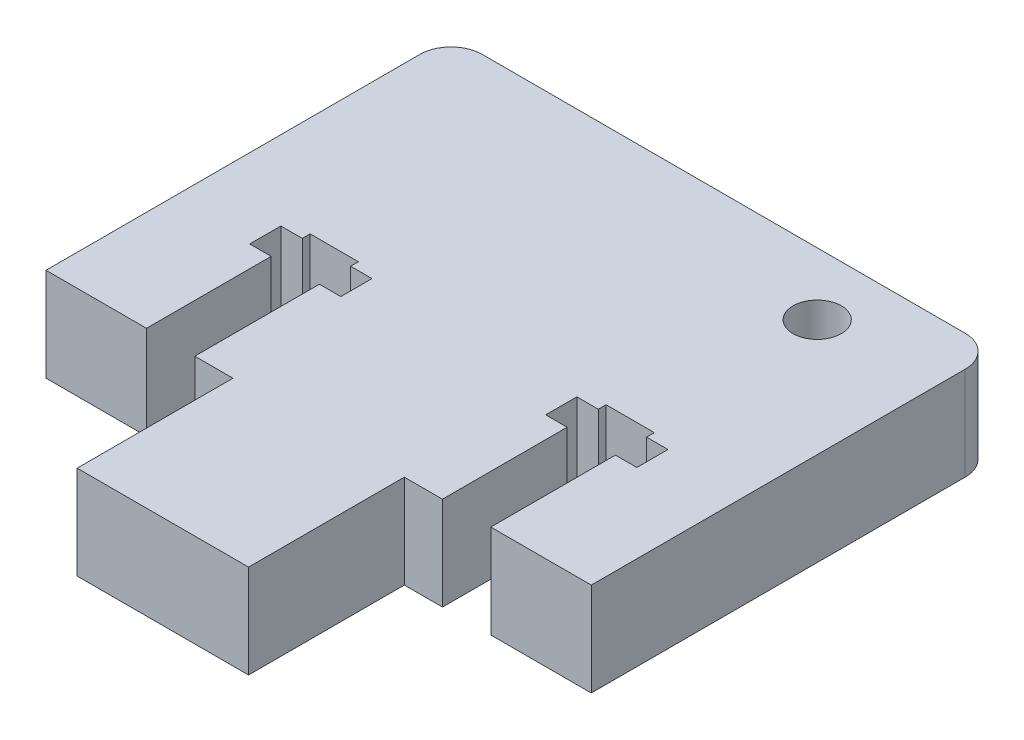
ISO-10303-21;
HEADER;
FILE_DESCRIPTION(('STEP AP214'),'2;1');
FILE_NAME('part.step','',(''),(''),'','','');
FILE_SCHEMA(('AUTOMOTIVE_DESIGN { 1 0 10303 214 1 1 1 1 }'));
ENDSEC;
DATA;
#1=APPLICATION_CONTEXT('core data for automotive mechanical design processes');
#2=APPLICATION_PROTOCOL_DEFINITION('international standard','automotive_design',2000,#1);
#3=PRODUCT_CONTEXT('',#1,'mechanical');
#4=PRODUCT('Part','Part','',(#3));
#5=PRODUCT_RELATED_PRODUCT_CATEGORY('part','',(#4));
#6=PRODUCT_DEFINITION_FORMATION('','',#4);
#7=PRODUCT_DEFINITION_CONTEXT('part definition',#1,'design');
#8=PRODUCT_DEFINITION('design','',#6,#7);
#9=PRODUCT_DEFINITION_SHAPE('','',#8);
#10=(LENGTH_UNIT() NAMED_UNIT(*) SI_UNIT(.MILLI.,.METRE.));
#11=(NAMED_UNIT(*) PLANE_ANGLE_UNIT() SI_UNIT($,.RADIAN.));
#12=(NAMED_UNIT(*) SI_UNIT($,.STERADIAN.) SOLID_ANGLE_UNIT());
#13=UNCERTAINTY_MEASURE_WITH_UNIT(LENGTH_MEASURE(1.E-05),#10,'distance_accuracy_value','');
#14=(GEOMETRIC_REPRESENTATION_CONTEXT(3) GLOBAL_UNCERTAINTY_ASSIGNED_CONTEXT((#13)) GLOBAL_UNIT_ASSIGNED_CONTEXT((#10,
#11,#12)) REPRESENTATION_CONTEXT('',''));
#15=CARTESIAN_POINT('',(0.,0.,0.));
#16=DIRECTION('',(0.,0.,1.));
#17=DIRECTION('',(1.,0.,0.));
#18=AXIS2_PLACEMENT_3D('',#15,#16,#17);
#19=CARTESIAN_POINT('',(0.,0.,-6.));
#20=DIRECTION('',(0.,0.,-1.));
#21=DIRECTION('',(-1.,0.,0.));
#22=AXIS2_PLACEMENT_3D('',#19,#20,#21);
#23=PLANE('',#22);
#24=DIRECTION('',(1.,0.,0.));
#25=VECTOR('',#24,1.);
#26=CARTESIAN_POINT('',(74.7240728219367,-88.0623732708443,-6.));
#27=LINE('',#26,#25);
#28=CARTESIAN_POINT('',(76.7240728219367,-88.0623732708443,-6.));
#29=VERTEX_POINT('',#28);
#30=CARTESIAN_POINT('',(107.724072821937,-88.0623732708443,-6.));
#31=VERTEX_POINT('',#30);
#32=EDGE_CURVE('E59',#29,#31,#27,.T.);
#33=ORIENTED_EDGE('',*,*,#32,.F.);
#34=DIRECTION('',(0.,-1.,0.));
#35=VECTOR('',#34,1.);
#36=CARTESIAN_POINT('',(76.7240728219367,-82.0623732708443,-6.));
#37=LINE('',#36,#35);
#38=CARTESIAN_POINT('',(76.7240728219367,-82.0623732708443,-6.));
#39=VERTEX_POINT('',#38);
#40=EDGE_CURVE('E263',#39,#29,#37,.T.);
#41=ORIENTED_EDGE('',*,*,#40,.F.);
#42=DIRECTION('',(-1.,0.,0.));
#43=VECTOR('',#42,1.);
#44=CARTESIAN_POINT('',(74.7240728219367,-82.0623732708443,-6.));
#45=LINE('',#44,#43);
#46=CARTESIAN_POINT('',(107.724072821937,-82.0623732708443,-6.));
#47=VERTEX_POINT('',#46);
#48=EDGE_CURVE('E273',#47,#39,#45,.T.);
#49=ORIENTED_EDGE('',*,*,#48,.F.);
#50=DIRECTION('',(0.,-1.,0.));
#51=VECTOR('',#50,1.);
#52=CARTESIAN_POINT('',(107.724072821937,-82.0623732708443,-6.));
#53=LINE('',#52,#51);
#54=EDGE_CURVE('E482',#47,#31,#53,.T.);
#55=ORIENTED_EDGE('',*,*,#54,.T.);
#56=EDGE_LOOP('',(#33,#41,#49,#55));
#57=FACE_BOUND('',#56,.T.);
#58=ADVANCED_FACE('F34',(#57),#23,.T.);
#59=CARTESIAN_POINT('',(109.724072821937,-88.0623732708443,-6.));
#60=DIRECTION('',(1.,0.,0.));
#61=DIRECTION('',(0.,0.,-1.));
#62=AXIS2_PLACEMENT_3D('',#59,#60,#61);
#63=PLANE('',#62);
#64=DIRECTION('',(0.,0.,1.));
#65=VECTOR('',#64,1.);
#66=CARTESIAN_POINT('',(109.724072821937,-88.0623732708443,-6.));
#67=LINE('',#66,#65);
#68=CARTESIAN_POINT('',(109.724072821937,-88.0623732708443,-4.));
#69=VERTEX_POINT('',#68);
#70=CARTESIAN_POINT('',(109.724072821937,-88.0623732708443,20.));
#71=VERTEX_POINT('',#70);
#72=EDGE_CURVE('E305',#69,#71,#67,.T.);
#73=ORIENTED_EDGE('',*,*,#72,.F.);
#74=DIRECTION('',(0.,-1.,0.));
#75=VECTOR('',#74,1.);
#76=CARTESIAN_POINT('',(109.724072821937,-82.0623732708443,-4.));
#77=LINE('',#76,#75);
#78=CARTESIAN_POINT('',(109.724072821937,-82.0623732708443,-4.));
#79=VERTEX_POINT('',#78);
#80=EDGE_CURVE('E320',#79,#69,#77,.T.);
#81=ORIENTED_EDGE('',*,*,#80,.F.);
#82=DIRECTION('',(0.,0.,1.));
#83=VECTOR('',#82,1.);
#84=CARTESIAN_POINT('',(109.724072821937,-82.0623732708443,-6.));
#85=LINE('',#84,#83);
#86=CARTESIAN_POINT('',(109.724072821937,-82.0623732708443,20.));
#87=VERTEX_POINT('',#86);
#88=EDGE_CURVE('E43',#79,#87,#85,.T.);
#89=ORIENTED_EDGE('',*,*,#88,.T.);
#90=DIRECTION('',(0.,1.,0.));
#91=VECTOR('',#90,1.);
#92=CARTESIAN_POINT('',(109.724072821937,-88.0623732708443,20.));
#93=LINE('',#92,#91);
#94=EDGE_CURVE('E294',#71,#87,#93,.T.);
#95=ORIENTED_EDGE('',*,*,#94,.F.);
#96=EDGE_LOOP('',(#73,#81,#89,#95));
#97=FACE_BOUND('',#96,.T.);
#98=ADVANCED_FACE('F318',(#97),#63,.T.);
#99=CARTESIAN_POINT('',(0.,0.,20.));
#100=DIRECTION('',(0.,0.,-1.));
#101=DIRECTION('',(-1.,0.,0.));
#102=AXIS2_PLACEMENT_3D('',#99,#100,#101);
#103=PLANE('',#102);
#104=DIRECTION('',(-1.,0.,0.));
#105=VECTOR('',#104,1.);
#106=CARTESIAN_POINT('',(74.7240728219367,-82.0623732708443,20.));
#107=LINE('',#106,#105);
#108=CARTESIAN_POINT('',(86.7240728219367,-82.0623732708443,20.));
#109=VERTEX_POINT('',#108);
#110=CARTESIAN_POINT('',(84.2740728219367,-82.0623732708443,20.));
#111=VERTEX_POINT('',#110);
#112=EDGE_CURVE('E432',#109,#111,#107,.T.);
#113=ORIENTED_EDGE('',*,*,#112,.T.);
#114=DIRECTION('',(0.,-1.,0.));
#115=VECTOR('',#114,1.);
#116=CARTESIAN_POINT('',(84.2740728219367,-82.0623732708443,20.));
#117=LINE('',#116,#115);
#118=CARTESIAN_POINT('',(84.2740728219367,-88.0623732708443,20.));
#119=VERTEX_POINT('',#118);
#120=EDGE_CURVE('E478',#111,#119,#117,.T.);
#121=ORIENTED_EDGE('',*,*,#120,.T.);
#122=DIRECTION('',(1.,0.,0.));
#123=VECTOR('',#122,1.);
#124=CARTESIAN_POINT('',(74.7240728219367,-88.0623732708443,20.));
#125=LINE('',#124,#123);
#126=CARTESIAN_POINT('',(86.7240728219367,-88.0623732708443,20.));
#127=VERTEX_POINT('',#126);
#128=EDGE_CURVE('E295',#119,#127,#125,.T.);
#129=ORIENTED_EDGE('',*,*,#128,.T.);
#130=DIRECTION('',(0.,-1.,0.));
#131=VECTOR('',#130,1.);
#132=CARTESIAN_POINT('',(86.7240728219367,-88.0623732708443,20.));
#133=LINE('',#132,#131);
#134=EDGE_CURVE('E538',#109,#127,#133,.T.);
#135=ORIENTED_EDGE('',*,*,#134,.F.);
#136=EDGE_LOOP('',(#113,#121,#129,#135));
#137=FACE_BOUND('',#136,.T.);
#138=ADVANCED_FACE('F578',(#137),#103,.F.);
#139=DIRECTION('',(0.,1.,0.));
#140=VECTOR('',#139,1.);
#141=CARTESIAN_POINT('',(97.7240728219367,-88.0623732708443,20.));
#142=LINE('',#141,#140);
#143=CARTESIAN_POINT('',(97.7240728219367,-88.0623732708443,20.));
#144=VERTEX_POINT('',#143);
#145=CARTESIAN_POINT('',(97.7240728219367,-82.0623732708443,20.));
#146=VERTEX_POINT('',#145);
#147=EDGE_CURVE('E513',#144,#146,#142,.T.);
#148=ORIENTED_EDGE('',*,*,#147,.F.);
#149=CARTESIAN_POINT('',(100.174072821937,-88.0623732708443,20.));
#150=VERTEX_POINT('',#149);
#151=EDGE_CURVE('E285',#144,#150,#125,.T.);
#152=ORIENTED_EDGE('',*,*,#151,.T.);
#153=DIRECTION('',(0.,-1.,0.));
#154=VECTOR('',#153,1.);
#155=CARTESIAN_POINT('',(100.174072821937,-82.0623732708443,20.));
#156=LINE('',#155,#154);
#157=CARTESIAN_POINT('',(100.174072821937,-82.0623732708443,20.));
#158=VERTEX_POINT('',#157);
#159=EDGE_CURVE('E411',#158,#150,#156,.T.);
#160=ORIENTED_EDGE('',*,*,#159,.F.);
#161=EDGE_CURVE('E302',#158,#146,#107,.T.);
#162=ORIENTED_EDGE('',*,*,#161,.T.);
#163=EDGE_LOOP('',(#148,#152,#160,#162));
#164=FACE_BOUND('',#163,.T.);
#165=ADVANCED_FACE('F580',(#164),#103,.F.);
#166=CARTESIAN_POINT('',(74.7240728219367,-88.0623732708443,20.));
#167=VERTEX_POINT('',#166);
#168=CARTESIAN_POINT('',(81.1740728219367,-88.0623732708443,20.));
#169=VERTEX_POINT('',#168);
#170=EDGE_CURVE('E287',#167,#169,#125,.T.);
#171=ORIENTED_EDGE('',*,*,#170,.T.);
#172=DIRECTION('',(0.,-1.,0.));
#173=VECTOR('',#172,1.);
#174=CARTESIAN_POINT('',(81.1740728219367,-82.0623732708443,20.));
#175=LINE('',#174,#173);
#176=CARTESIAN_POINT('',(81.1740728219367,-82.0623732708443,20.));
#177=VERTEX_POINT('',#176);
#178=EDGE_CURVE('E439',#177,#169,#175,.T.);
#179=ORIENTED_EDGE('',*,*,#178,.F.);
#180=CARTESIAN_POINT('',(74.7240728219367,-82.0623732708443,20.));
#181=VERTEX_POINT('',#180);
#182=EDGE_CURVE('E298',#177,#181,#107,.T.);
#183=ORIENTED_EDGE('',*,*,#182,.T.);
#184=DIRECTION('',(0.,-1.,0.));
#185=VECTOR('',#184,1.);
#186=CARTESIAN_POINT('',(74.7240728219367,-88.0623732708443,20.));
#187=LINE('',#186,#185);
#188=EDGE_CURVE('E277',#181,#167,#187,.T.);
#189=ORIENTED_EDGE('',*,*,#188,.T.);
#190=EDGE_LOOP('',(#171,#179,#183,#189));
#191=FACE_BOUND('',#190,.T.);
#192=ADVANCED_FACE('F438',(#191),#103,.F.);
#193=CARTESIAN_POINT('',(103.274072821937,-82.0623732708443,20.));
#194=VERTEX_POINT('',#193);
#195=EDGE_CURVE('E299',#87,#194,#107,.T.);
#196=ORIENTED_EDGE('',*,*,#195,.T.);
#197=DIRECTION('',(0.,-1.,0.));
#198=VECTOR('',#197,1.);
#199=CARTESIAN_POINT('',(103.274072821937,-82.0623732708443,20.));
#200=LINE('',#199,#198);
#201=CARTESIAN_POINT('',(103.274072821937,-88.0623732708443,20.));
#202=VERTEX_POINT('',#201);
#203=EDGE_CURVE('E291',#194,#202,#200,.T.);
#204=ORIENTED_EDGE('',*,*,#203,.T.);
#205=EDGE_CURVE('E281',#202,#71,#125,.T.);
#206=ORIENTED_EDGE('',*,*,#205,.T.);
#207=ORIENTED_EDGE('',*,*,#94,.T.);
#208=EDGE_LOOP('',(#196,#204,#206,#207));
#209=FACE_BOUND('',#208,.T.);
#210=ADVANCED_FACE('F316',(#209),#103,.F.);
#211=CARTESIAN_POINT('',(74.7240728219367,-88.0623732708443,-6.));
#212=DIRECTION('',(-1.,0.,0.));
#213=DIRECTION('',(0.,0.,1.));
#214=AXIS2_PLACEMENT_3D('',#211,#212,#213);
#215=PLANE('',#214);
#216=DIRECTION('',(0.,-1.,0.));
#217=VECTOR('',#216,1.);
#218=CARTESIAN_POINT('',(74.7240728219367,-82.0623732708443,-4.));
#219=LINE('',#218,#217);
#220=CARTESIAN_POINT('',(74.7240728219367,-82.0623732708443,-4.));
#221=VERTEX_POINT('',#220);
#222=CARTESIAN_POINT('',(74.7240728219367,-88.0623732708443,-4.));
#223=VERTEX_POINT('',#222);
#224=EDGE_CURVE('E256',#221,#223,#219,.T.);
#225=ORIENTED_EDGE('',*,*,#224,.T.);
#226=DIRECTION('',(0.,0.,1.));
#227=VECTOR('',#226,1.);
#228=CARTESIAN_POINT('',(74.7240728219367,-88.0623732708443,-6.));
#229=LINE('',#228,#227);
#230=EDGE_CURVE('E38',#223,#167,#229,.T.);
#231=ORIENTED_EDGE('',*,*,#230,.T.);
#232=ORIENTED_EDGE('',*,*,#188,.F.);
#233=DIRECTION('',(0.,0.,1.));
#234=VECTOR('',#233,1.);
#235=CARTESIAN_POINT('',(74.7240728219367,-82.0623732708443,-6.));
#236=LINE('',#235,#234);
#237=EDGE_CURVE('E11',#221,#181,#236,.T.);
#238=ORIENTED_EDGE('',*,*,#237,.F.);
#239=EDGE_LOOP('',(#225,#231,#232,#238));
#240=FACE_BOUND('',#239,.T.);
#241=ADVANCED_FACE('F36',(#240),#215,.T.);
#242=CARTESIAN_POINT('',(74.7240728219367,-82.0623732708443,-6.));
#243=DIRECTION('',(0.,1.,0.));
#244=DIRECTION('',(0.,0.,1.));
#245=AXIS2_PLACEMENT_3D('',#242,#243,#244);
#246=PLANE('',#245);
#247=CARTESIAN_POINT('',(76.7240728219367,-82.0623732708443,-4.));
#248=DIRECTION('',(0.,1.,0.));
#249=DIRECTION('',(0.,0.,-1.));
#250=AXIS2_PLACEMENT_3D('',#247,#248,#249);
#251=CIRCLE('',#250,2.);
#252=EDGE_CURVE('E51',#39,#221,#251,.T.);
#253=ORIENTED_EDGE('',*,*,#252,.T.);
#254=ORIENTED_EDGE('',*,*,#237,.T.);
#255=ORIENTED_EDGE('',*,*,#182,.F.);
#256=DIRECTION('',(0.,0.,-1.));
#257=VECTOR('',#256,1.);
#258=CARTESIAN_POINT('',(81.1740728219367,-82.0623732708443,20.));
#259=LINE('',#258,#257);
#260=CARTESIAN_POINT('',(81.1740728219367,-82.0623732708443,12.));
#261=VERTEX_POINT('',#260);
#262=EDGE_CURVE('E442',#177,#261,#259,.T.);
#263=ORIENTED_EDGE('',*,*,#262,.T.);
#264=DIRECTION('',(-1.,0.,0.));
#265=VECTOR('',#264,1.);
#266=CARTESIAN_POINT('',(81.1740728219367,-82.0623732708443,12.));
#267=LINE('',#266,#265);
#268=CARTESIAN_POINT('',(79.7990728219367,-82.0623732708443,12.));
#269=VERTEX_POINT('',#268);
#270=EDGE_CURVE('E445',#261,#269,#267,.T.);
#271=ORIENTED_EDGE('',*,*,#270,.T.);
#272=DIRECTION('',(0.,0.,-1.));
#273=VECTOR('',#272,1.);
#274=CARTESIAN_POINT('',(79.7990728219367,-82.0623732708443,10.));
#275=LINE('',#274,#273);
#276=CARTESIAN_POINT('',(79.7990728219367,-82.0623732708443,10.));
#277=VERTEX_POINT('',#276);
#278=EDGE_CURVE('E449',#269,#277,#275,.T.);
#279=ORIENTED_EDGE('',*,*,#278,.T.);
#280=DIRECTION('',(1.,0.,0.));
#281=VECTOR('',#280,1.);
#282=CARTESIAN_POINT('',(81.1740728219367,-82.0623732708443,10.));
#283=LINE('',#282,#281);
#284=CARTESIAN_POINT('',(81.1740728219367,-82.0623732708443,10.));
#285=VERTEX_POINT('',#284);
#286=EDGE_CURVE('E457',#277,#285,#283,.T.);
#287=ORIENTED_EDGE('',*,*,#286,.T.);
#288=DIRECTION('',(0.,0.,-1.));
#289=VECTOR('',#288,1.);
#290=CARTESIAN_POINT('',(81.1740728219367,-82.0623732708443,10.));
#291=LINE('',#290,#289);
#292=CARTESIAN_POINT('',(81.1740728219367,-82.0623732708443,9.5));
#293=VERTEX_POINT('',#292);
#294=EDGE_CURVE('E460',#285,#293,#291,.T.);
#295=ORIENTED_EDGE('',*,*,#294,.T.);
#296=DIRECTION('',(1.,0.,0.));
#297=VECTOR('',#296,1.);
#298=CARTESIAN_POINT('',(84.2740728219367,-82.0623732708443,9.5));
#299=LINE('',#298,#297);
#300=CARTESIAN_POINT('',(84.2740728219367,-82.0623732708443,9.5));
#301=VERTEX_POINT('',#300);
#302=EDGE_CURVE('E463',#293,#301,#299,.T.);
#303=ORIENTED_EDGE('',*,*,#302,.T.);
#304=DIRECTION('',(0.,0.,1.));
#305=VECTOR('',#304,1.);
#306=CARTESIAN_POINT('',(84.2740728219367,-82.0623732708443,10.));
#307=LINE('',#306,#305);
#308=CARTESIAN_POINT('',(84.2740728219367,-82.0623732708443,10.));
#309=VERTEX_POINT('',#308);
#310=EDGE_CURVE('E466',#301,#309,#307,.T.);
#311=ORIENTED_EDGE('',*,*,#310,.T.);
#312=DIRECTION('',(1.,0.,0.));
#313=VECTOR('',#312,1.);
#314=CARTESIAN_POINT('',(85.6490728219367,-82.0623732708443,10.));
#315=LINE('',#314,#313);
#316=CARTESIAN_POINT('',(85.6490728219367,-82.0623732708443,10.));
#317=VERTEX_POINT('',#316);
#318=EDGE_CURVE('E469',#309,#317,#315,.T.);
#319=ORIENTED_EDGE('',*,*,#318,.T.);
#320=DIRECTION('',(0.,0.,1.));
#321=VECTOR('',#320,1.);
#322=CARTESIAN_POINT('',(85.6490728219367,-82.0623732708443,10.));
#323=LINE('',#322,#321);
#324=CARTESIAN_POINT('',(85.6490728219367,-82.0623732708443,12.));
#325=VERTEX_POINT('',#324);
#326=EDGE_CURVE('E472',#317,#325,#323,.T.);
#327=ORIENTED_EDGE('',*,*,#326,.T.);
#328=DIRECTION('',(-1.,0.,0.));
#329=VECTOR('',#328,1.);
#330=CARTESIAN_POINT('',(85.6490728219367,-82.0623732708443,12.));
#331=LINE('',#330,#329);
#332=CARTESIAN_POINT('',(84.2740728219367,-82.0623732708443,12.));
#333=VERTEX_POINT('',#332);
#334=EDGE_CURVE('E475',#325,#333,#331,.T.);
#335=ORIENTED_EDGE('',*,*,#334,.T.);
#336=DIRECTION('',(0.,0.,1.));
#337=VECTOR('',#336,1.);
#338=CARTESIAN_POINT('',(84.2740728219367,-82.0623732708443,20.));
#339=LINE('',#338,#337);
#340=EDGE_CURVE('E447',#333,#111,#339,.T.);
#341=ORIENTED_EDGE('',*,*,#340,.T.);
#342=ORIENTED_EDGE('',*,*,#112,.F.);
#343=DIRECTION('',(0.,0.,-1.));
#344=VECTOR('',#343,1.);
#345=CARTESIAN_POINT('',(86.7240728219367,-82.0623732708443,30.));
#346=LINE('',#345,#344);
#347=CARTESIAN_POINT('',(86.7240728219367,-82.0623732708443,30.));
#348=VERTEX_POINT('',#347);
#349=EDGE_CURVE('E553',#348,#109,#346,.T.);
#350=ORIENTED_EDGE('',*,*,#349,.F.);
#351=DIRECTION('',(-1.,0.,0.));
#352=VECTOR('',#351,1.);
#353=CARTESIAN_POINT('',(97.7240728219367,-82.0623732708443,30.));
#354=LINE('',#353,#352);
#355=CARTESIAN_POINT('',(97.7240728219367,-82.0623732708443,30.));
#356=VERTEX_POINT('',#355);
#357=EDGE_CURVE('E537',#356,#348,#354,.T.);
#358=ORIENTED_EDGE('',*,*,#357,.F.);
#359=DIRECTION('',(0.,0.,-1.));
#360=VECTOR('',#359,1.);
#361=CARTESIAN_POINT('',(97.7240728219367,-82.0623732708443,30.));
#362=LINE('',#361,#360);
#363=EDGE_CURVE('E430',#356,#146,#362,.T.);
#364=ORIENTED_EDGE('',*,*,#363,.T.);
#365=ORIENTED_EDGE('',*,*,#161,.F.);
#366=DIRECTION('',(0.,0.,-1.));
#367=VECTOR('',#366,1.);
#368=CARTESIAN_POINT('',(100.174072821937,-82.0623732708443,20.));
#369=LINE('',#368,#367);
#370=CARTESIAN_POINT('',(100.174072821937,-82.0623732708443,12.));
#371=VERTEX_POINT('',#370);
#372=EDGE_CURVE('E330',#158,#371,#369,.T.);
#373=ORIENTED_EDGE('',*,*,#372,.T.);
#374=DIRECTION('',(-1.,0.,0.));
#375=VECTOR('',#374,1.);
#376=CARTESIAN_POINT('',(100.174072821937,-82.0623732708443,12.));
#377=LINE('',#376,#375);
#378=CARTESIAN_POINT('',(98.7990728219367,-82.0623732708443,12.));
#379=VERTEX_POINT('',#378);
#380=EDGE_CURVE('E334',#371,#379,#377,.T.);
#381=ORIENTED_EDGE('',*,*,#380,.T.);
#382=DIRECTION('',(0.,0.,-1.));
#383=VECTOR('',#382,1.);
#384=CARTESIAN_POINT('',(98.7990728219367,-82.0623732708443,10.));
#385=LINE('',#384,#383);
#386=CARTESIAN_POINT('',(98.7990728219367,-82.0623732708443,10.));
#387=VERTEX_POINT('',#386);
#388=EDGE_CURVE('E345',#379,#387,#385,.T.);
#389=ORIENTED_EDGE('',*,*,#388,.T.);
#390=DIRECTION('',(1.,0.,0.));
#391=VECTOR('',#390,1.);
#392=CARTESIAN_POINT('',(100.174072821937,-82.0623732708443,10.));
#393=LINE('',#392,#391);
#394=CARTESIAN_POINT('',(100.174072821937,-82.0623732708443,10.));
#395=VERTEX_POINT('',#394);
#396=EDGE_CURVE('E348',#387,#395,#393,.T.);
#397=ORIENTED_EDGE('',*,*,#396,.T.);
#398=DIRECTION('',(0.,0.,-1.));
#399=VECTOR('',#398,1.);
#400=CARTESIAN_POINT('',(100.174072821937,-82.0623732708443,10.));
#401=LINE('',#400,#399);
#402=CARTESIAN_POINT('',(100.174072821937,-82.0623732708443,9.5));
#403=VERTEX_POINT('',#402);
#404=EDGE_CURVE('E351',#395,#403,#401,.T.);
#405=ORIENTED_EDGE('',*,*,#404,.T.);
#406=DIRECTION('',(1.,0.,0.));
#407=VECTOR('',#406,1.);
#408=CARTESIAN_POINT('',(103.274072821937,-82.0623732708443,9.5));
#409=LINE('',#408,#407);
#410=CARTESIAN_POINT('',(103.274072821937,-82.0623732708443,9.5));
#411=VERTEX_POINT('',#410);
#412=EDGE_CURVE('E354',#403,#411,#409,.T.);
#413=ORIENTED_EDGE('',*,*,#412,.T.);
#414=DIRECTION('',(0.,0.,1.));
#415=VECTOR('',#414,1.);
#416=CARTESIAN_POINT('',(103.274072821937,-82.0623732708443,10.));
#417=LINE('',#416,#415);
#418=CARTESIAN_POINT('',(103.274072821937,-82.0623732708443,10.));
#419=VERTEX_POINT('',#418);
#420=EDGE_CURVE('E357',#411,#419,#417,.T.);
#421=ORIENTED_EDGE('',*,*,#420,.T.);
#422=DIRECTION('',(1.,0.,0.));
#423=VECTOR('',#422,1.);
#424=CARTESIAN_POINT('',(104.649072821937,-82.0623732708443,10.));
#425=LINE('',#424,#423);
#426=CARTESIAN_POINT('',(104.649072821937,-82.0623732708443,10.));
#427=VERTEX_POINT('',#426);
#428=EDGE_CURVE('E360',#419,#427,#425,.T.);
#429=ORIENTED_EDGE('',*,*,#428,.T.);
#430=DIRECTION('',(0.,0.,1.));
#431=VECTOR('',#430,1.);
#432=CARTESIAN_POINT('',(104.649072821937,-82.0623732708443,10.));
#433=LINE('',#432,#431);
#434=CARTESIAN_POINT('',(104.649072821937,-82.0623732708443,12.));
#435=VERTEX_POINT('',#434);
#436=EDGE_CURVE('E363',#427,#435,#433,.T.);
#437=ORIENTED_EDGE('',*,*,#436,.T.);
#438=DIRECTION('',(-1.,0.,0.));
#439=VECTOR('',#438,1.);
#440=CARTESIAN_POINT('',(104.649072821937,-82.0623732708443,12.));
#441=LINE('',#440,#439);
#442=CARTESIAN_POINT('',(103.274072821937,-82.0623732708443,12.));
#443=VERTEX_POINT('',#442);
#444=EDGE_CURVE('E328',#435,#443,#441,.T.);
#445=ORIENTED_EDGE('',*,*,#444,.T.);
#446=DIRECTION('',(0.,0.,1.));
#447=VECTOR('',#446,1.);
#448=CARTESIAN_POINT('',(103.274072821937,-82.0623732708443,20.));
#449=LINE('',#448,#447);
#450=EDGE_CURVE('E325',#443,#194,#449,.T.);
#451=ORIENTED_EDGE('',*,*,#450,.T.);
#452=ORIENTED_EDGE('',*,*,#195,.F.);
#453=ORIENTED_EDGE('',*,*,#88,.F.);
#454=CARTESIAN_POINT('',(107.724072821937,-82.0623732708443,-4.));
#455=DIRECTION('',(0.,1.,0.));
#456=DIRECTION('',(0.,0.,1.));
#457=AXIS2_PLACEMENT_3D('',#454,#455,#456);
#458=CIRCLE('',#457,2.);
#459=EDGE_CURVE('E321',#79,#47,#458,.T.);
#460=ORIENTED_EDGE('',*,*,#459,.T.);
#461=ORIENTED_EDGE('',*,*,#48,.T.);
#462=EDGE_LOOP('',(#253,#254,#255,#263,#271,#279,#287,#295,#303,#311,#319,#327,#335,#341,#342,
#350,#358,#364,#365,#373,#381,#389,#397,#405,#413,#421,#429,#437,#445,#451,#452,#453,#460,#461));
#463=FACE_BOUND('',#462,.T.);
#464=CARTESIAN_POINT('',(102.224072821937,-82.0623732708443,-2.));
#465=DIRECTION('',(0.,-1.,0.));
#466=DIRECTION('',(0.,0.,-1.));
#467=AXIS2_PLACEMENT_3D('',#464,#465,#466);
#468=CIRCLE('',#467,1.54999999999999);
#469=CARTESIAN_POINT('',(102.224072821937,-82.0623732708443,-3.54999999999999));
#470=VERTEX_POINT('',#469);
#471=EDGE_CURVE('E369',#470,#470,#468,.T.);
#472=ORIENTED_EDGE('',*,*,#471,.T.);
#473=EDGE_LOOP('',(#472));
#474=FACE_BOUND('',#473,.T.);
#475=ADVANCED_FACE('F267',(#463,#474),#246,.T.);
#476=CARTESIAN_POINT('',(74.7240728219367,-88.0623732708443,-6.));
#477=DIRECTION('',(0.,-1.,0.));
#478=DIRECTION('',(0.,0.,-1.));
#479=AXIS2_PLACEMENT_3D('',#476,#477,#478);
#480=PLANE('',#479);
#481=CARTESIAN_POINT('',(76.7240728219367,-88.0623732708443,-4.));
#482=DIRECTION('',(0.,1.,0.));
#483=DIRECTION('',(0.,0.,-1.));
#484=AXIS2_PLACEMENT_3D('',#481,#482,#483);
#485=CIRCLE('',#484,2.);
#486=EDGE_CURVE('E258',#29,#223,#485,.T.);
#487=ORIENTED_EDGE('',*,*,#486,.F.);
#488=ORIENTED_EDGE('',*,*,#32,.T.);
#489=CARTESIAN_POINT('',(107.724072821937,-88.0623732708443,-4.));
#490=DIRECTION('',(0.,1.,0.));
#491=DIRECTION('',(0.,0.,1.));
#492=AXIS2_PLACEMENT_3D('',#489,#490,#491);
#493=CIRCLE('',#492,2.);
#494=EDGE_CURVE('E262',#69,#31,#493,.T.);
#495=ORIENTED_EDGE('',*,*,#494,.F.);
#496=ORIENTED_EDGE('',*,*,#72,.T.);
#497=ORIENTED_EDGE('',*,*,#205,.F.);
#498=DIRECTION('',(0.,0.,1.));
#499=VECTOR('',#498,1.);
#500=CARTESIAN_POINT('',(103.274072821937,-88.0623732708443,20.));
#501=LINE('',#500,#499);
#502=CARTESIAN_POINT('',(103.274072821937,-88.0623732708443,12.));
#503=VERTEX_POINT('',#502);
#504=EDGE_CURVE('E366',#503,#202,#501,.T.);
#505=ORIENTED_EDGE('',*,*,#504,.F.);
#506=DIRECTION('',(-1.,0.,0.));
#507=VECTOR('',#506,1.);
#508=CARTESIAN_POINT('',(104.649072821937,-88.0623732708443,12.));
#509=LINE('',#508,#507);
#510=CARTESIAN_POINT('',(104.649072821937,-88.0623732708443,12.));
#511=VERTEX_POINT('',#510);
#512=EDGE_CURVE('E331',#511,#503,#509,.T.);
#513=ORIENTED_EDGE('',*,*,#512,.F.);
#514=DIRECTION('',(0.,0.,1.));
#515=VECTOR('',#514,1.);
#516=CARTESIAN_POINT('',(104.649072821937,-88.0623732708443,10.));
#517=LINE('',#516,#515);
#518=CARTESIAN_POINT('',(104.649072821937,-88.0623732708443,10.));
#519=VERTEX_POINT('',#518);
#520=EDGE_CURVE('E337',#519,#511,#517,.T.);
#521=ORIENTED_EDGE('',*,*,#520,.F.);
#522=DIRECTION('',(1.,0.,0.));
#523=VECTOR('',#522,1.);
#524=CARTESIAN_POINT('',(104.649072821937,-88.0623732708443,10.));
#525=LINE('',#524,#523);
#526=CARTESIAN_POINT('',(103.274072821937,-88.0623732708443,10.));
#527=VERTEX_POINT('',#526);
#528=EDGE_CURVE('E390',#527,#519,#525,.T.);
#529=ORIENTED_EDGE('',*,*,#528,.F.);
#530=DIRECTION('',(0.,0.,1.));
#531=VECTOR('',#530,1.);
#532=CARTESIAN_POINT('',(103.274072821937,-88.0623732708443,10.));
#533=LINE('',#532,#531);
#534=CARTESIAN_POINT('',(103.274072821937,-88.0623732708443,9.5));
#535=VERTEX_POINT('',#534);
#536=EDGE_CURVE('E387',#535,#527,#533,.T.);
#537=ORIENTED_EDGE('',*,*,#536,.F.);
#538=DIRECTION('',(1.,0.,0.));
#539=VECTOR('',#538,1.);
#540=CARTESIAN_POINT('',(103.274072821937,-88.0623732708443,9.5));
#541=LINE('',#540,#539);
#542=CARTESIAN_POINT('',(100.174072821937,-88.0623732708443,9.5));
#543=VERTEX_POINT('',#542);
#544=EDGE_CURVE('E384',#543,#535,#541,.T.);
#545=ORIENTED_EDGE('',*,*,#544,.F.);
#546=DIRECTION('',(0.,0.,-1.));
#547=VECTOR('',#546,1.);
#548=CARTESIAN_POINT('',(100.174072821937,-88.0623732708443,10.));
#549=LINE('',#548,#547);
#550=CARTESIAN_POINT('',(100.174072821937,-88.0623732708443,10.));
#551=VERTEX_POINT('',#550);
#552=EDGE_CURVE('E381',#551,#543,#549,.T.);
#553=ORIENTED_EDGE('',*,*,#552,.F.);
#554=DIRECTION('',(1.,0.,0.));
#555=VECTOR('',#554,1.);
#556=CARTESIAN_POINT('',(100.174072821937,-88.0623732708443,10.));
#557=LINE('',#556,#555);
#558=CARTESIAN_POINT('',(98.7990728219367,-88.0623732708443,10.));
#559=VERTEX_POINT('',#558);
#560=EDGE_CURVE('E378',#559,#551,#557,.T.);
#561=ORIENTED_EDGE('',*,*,#560,.F.);
#562=DIRECTION('',(0.,0.,-1.));
#563=VECTOR('',#562,1.);
#564=CARTESIAN_POINT('',(98.7990728219367,-88.0623732708443,10.));
#565=LINE('',#564,#563);
#566=CARTESIAN_POINT('',(98.7990728219367,-88.0623732708443,12.));
#567=VERTEX_POINT('',#566);
#568=EDGE_CURVE('E375',#567,#559,#565,.T.);
#569=ORIENTED_EDGE('',*,*,#568,.F.);
#570=DIRECTION('',(-1.,0.,0.));
#571=VECTOR('',#570,1.);
#572=CARTESIAN_POINT('',(100.174072821937,-88.0623732708443,12.));
#573=LINE('',#572,#571);
#574=CARTESIAN_POINT('',(100.174072821937,-88.0623732708443,12.));
#575=VERTEX_POINT('',#574);
#576=EDGE_CURVE('E372',#575,#567,#573,.T.);
#577=ORIENTED_EDGE('',*,*,#576,.F.);
#578=DIRECTION('',(0.,0.,-1.));
#579=VECTOR('',#578,1.);
#580=CARTESIAN_POINT('',(100.174072821937,-88.0623732708443,20.));
#581=LINE('',#580,#579);
#582=EDGE_CURVE('E368',#150,#575,#581,.T.);
#583=ORIENTED_EDGE('',*,*,#582,.F.);
#584=ORIENTED_EDGE('',*,*,#151,.F.);
#585=DIRECTION('',(0.,0.,-1.));
#586=VECTOR('',#585,1.);
#587=CARTESIAN_POINT('',(97.7240728219367,-88.0623732708443,30.));
#588=LINE('',#587,#586);
#589=CARTESIAN_POINT('',(97.7240728219367,-88.0623732708443,30.));
#590=VERTEX_POINT('',#589);
#591=EDGE_CURVE('E544',#590,#144,#588,.T.);
#592=ORIENTED_EDGE('',*,*,#591,.F.);
#593=DIRECTION('',(1.,0.,0.));
#594=VECTOR('',#593,1.);
#595=CARTESIAN_POINT('',(97.7240728219367,-88.0623732708443,30.));
#596=LINE('',#595,#594);
#597=CARTESIAN_POINT('',(86.7240728219367,-88.0623732708443,30.));
#598=VERTEX_POINT('',#597);
#599=EDGE_CURVE('E542',#598,#590,#596,.T.);
#600=ORIENTED_EDGE('',*,*,#599,.F.);
#601=DIRECTION('',(0.,0.,-1.));
#602=VECTOR('',#601,1.);
#603=CARTESIAN_POINT('',(86.7240728219367,-88.0623732708443,30.));
#604=LINE('',#603,#602);
#605=EDGE_CURVE('E550',#598,#127,#604,.T.);
#606=ORIENTED_EDGE('',*,*,#605,.T.);
#607=ORIENTED_EDGE('',*,*,#128,.F.);
#608=DIRECTION('',(0.,0.,1.));
#609=VECTOR('',#608,1.);
#610=CARTESIAN_POINT('',(84.2740728219367,-88.0623732708443,20.));
#611=LINE('',#610,#609);
#612=CARTESIAN_POINT('',(84.2740728219367,-88.0623732708443,12.));
#613=VERTEX_POINT('',#612);
#614=EDGE_CURVE('E479',#613,#119,#611,.T.);
#615=ORIENTED_EDGE('',*,*,#614,.F.);
#616=DIRECTION('',(-1.,0.,0.));
#617=VECTOR('',#616,1.);
#618=CARTESIAN_POINT('',(85.6490728219367,-88.0623732708443,12.));
#619=LINE('',#618,#617);
#620=CARTESIAN_POINT('',(85.6490728219367,-88.0623732708443,12.));
#621=VERTEX_POINT('',#620);
#622=EDGE_CURVE('E452',#621,#613,#619,.T.);
#623=ORIENTED_EDGE('',*,*,#622,.F.);
#624=DIRECTION('',(0.,0.,1.));
#625=VECTOR('',#624,1.);
#626=CARTESIAN_POINT('',(85.6490728219367,-88.0623732708443,10.));
#627=LINE('',#626,#625);
#628=CARTESIAN_POINT('',(85.6490728219367,-88.0623732708443,10.));
#629=VERTEX_POINT('',#628);
#630=EDGE_CURVE('E506',#629,#621,#627,.T.);
#631=ORIENTED_EDGE('',*,*,#630,.F.);
#632=DIRECTION('',(1.,0.,0.));
#633=VECTOR('',#632,1.);
#634=CARTESIAN_POINT('',(85.6490728219367,-88.0623732708443,10.));
#635=LINE('',#634,#633);
#636=CARTESIAN_POINT('',(84.2740728219367,-88.0623732708443,10.));
#637=VERTEX_POINT('',#636);
#638=EDGE_CURVE('E503',#637,#629,#635,.T.);
#639=ORIENTED_EDGE('',*,*,#638,.F.);
#640=DIRECTION('',(0.,0.,1.));
#641=VECTOR('',#640,1.);
#642=CARTESIAN_POINT('',(84.2740728219367,-88.0623732708443,10.));
#643=LINE('',#642,#641);
#644=CARTESIAN_POINT('',(84.2740728219367,-88.0623732708443,9.5));
#645=VERTEX_POINT('',#644);
#646=EDGE_CURVE('E500',#645,#637,#643,.T.);
#647=ORIENTED_EDGE('',*,*,#646,.F.);
#648=DIRECTION('',(1.,0.,0.));
#649=VECTOR('',#648,1.);
#650=CARTESIAN_POINT('',(84.2740728219367,-88.0623732708443,9.5));
#651=LINE('',#650,#649);
#652=CARTESIAN_POINT('',(81.1740728219367,-88.0623732708443,9.5));
#653=VERTEX_POINT('',#652);
#654=EDGE_CURVE('E497',#653,#645,#651,.T.);
#655=ORIENTED_EDGE('',*,*,#654,.F.);
#656=DIRECTION('',(0.,0.,-1.));
#657=VECTOR('',#656,1.);
#658=CARTESIAN_POINT('',(81.1740728219367,-88.0623732708443,10.));
#659=LINE('',#658,#657);
#660=CARTESIAN_POINT('',(81.1740728219367,-88.0623732708443,10.));
#661=VERTEX_POINT('',#660);
#662=EDGE_CURVE('E494',#661,#653,#659,.T.);
#663=ORIENTED_EDGE('',*,*,#662,.F.);
#664=DIRECTION('',(1.,0.,0.));
#665=VECTOR('',#664,1.);
#666=CARTESIAN_POINT('',(81.1740728219367,-88.0623732708443,10.));
#667=LINE('',#666,#665);
#668=CARTESIAN_POINT('',(79.7990728219367,-88.0623732708443,10.));
#669=VERTEX_POINT('',#668);
#670=EDGE_CURVE('E491',#669,#661,#667,.T.);
#671=ORIENTED_EDGE('',*,*,#670,.F.);
#672=DIRECTION('',(0.,0.,-1.));
#673=VECTOR('',#672,1.);
#674=CARTESIAN_POINT('',(79.7990728219367,-88.0623732708443,10.));
#675=LINE('',#674,#673);
#676=CARTESIAN_POINT('',(79.7990728219367,-88.0623732708443,12.));
#677=VERTEX_POINT('',#676);
#678=EDGE_CURVE('E488',#677,#669,#675,.T.);
#679=ORIENTED_EDGE('',*,*,#678,.F.);
#680=DIRECTION('',(-1.,0.,0.));
#681=VECTOR('',#680,1.);
#682=CARTESIAN_POINT('',(81.1740728219367,-88.0623732708443,12.));
#683=LINE('',#682,#681);
#684=CARTESIAN_POINT('',(81.1740728219367,-88.0623732708443,12.));
#685=VERTEX_POINT('',#684);
#686=EDGE_CURVE('E485',#685,#677,#683,.T.);
#687=ORIENTED_EDGE('',*,*,#686,.F.);
#688=DIRECTION('',(0.,0.,-1.));
#689=VECTOR('',#688,1.);
#690=CARTESIAN_POINT('',(81.1740728219367,-88.0623732708443,20.));
#691=LINE('',#690,#689);
#692=EDGE_CURVE('E481',#169,#685,#691,.T.);
#693=ORIENTED_EDGE('',*,*,#692,.F.);
#694=ORIENTED_EDGE('',*,*,#170,.F.);
#695=ORIENTED_EDGE('',*,*,#230,.F.);
#696=EDGE_LOOP('',(#487,#488,#495,#496,#497,#505,#513,#521,#529,#537,#545,#553,#561,#569,#577,
#583,#584,#592,#600,#606,#607,#615,#623,#631,#639,#647,#655,#663,#671,#679,#687,#693,#694,#695));
#697=FACE_BOUND('',#696,.T.);
#698=CARTESIAN_POINT('',(102.224072821937,-88.0623732708443,-2.));
#699=DIRECTION('',(0.,-1.,0.));
#700=DIRECTION('',(0.,0.,-1.));
#701=AXIS2_PLACEMENT_3D('',#698,#699,#700);
#702=CIRCLE('',#701,1.54999999999999);
#703=CARTESIAN_POINT('',(102.224072821937,-88.0623732708443,-3.54999999999999));
#704=VERTEX_POINT('',#703);
#705=EDGE_CURVE('E340',#704,#704,#702,.T.);
#706=ORIENTED_EDGE('',*,*,#705,.F.);
#707=EDGE_LOOP('',(#706));
#708=FACE_BOUND('',#707,.T.);
#709=ADVANCED_FACE('F308',(#697,#708),#480,.T.);
#710=CARTESIAN_POINT('',(103.274072821937,-82.0623732708443,20.));
#711=DIRECTION('',(1.,0.,0.));
#712=DIRECTION('',(0.,0.,-1.));
#713=AXIS2_PLACEMENT_3D('',#710,#711,#712);
#714=PLANE('',#713);
#715=ORIENTED_EDGE('',*,*,#504,.T.);
#716=ORIENTED_EDGE('',*,*,#203,.F.);
#717=ORIENTED_EDGE('',*,*,#450,.F.);
#718=DIRECTION('',(0.,-1.,0.));
#719=VECTOR('',#718,1.);
#720=CARTESIAN_POINT('',(103.274072821937,-82.0623732708443,12.));
#721=LINE('',#720,#719);
#722=EDGE_CURVE('E282',#443,#503,#721,.T.);
#723=ORIENTED_EDGE('',*,*,#722,.T.);
#724=EDGE_LOOP('',(#715,#716,#717,#723));
#725=FACE_BOUND('',#724,.T.);
#726=ADVANCED_FACE('F563',(#725),#714,.F.);
#727=CARTESIAN_POINT('',(104.649072821937,-82.0623732708443,12.));
#728=DIRECTION('',(0.,0.,1.));
#729=DIRECTION('',(1.,0.,0.));
#730=AXIS2_PLACEMENT_3D('',#727,#728,#729);
#731=PLANE('',#730);
#732=ORIENTED_EDGE('',*,*,#512,.T.);
#733=ORIENTED_EDGE('',*,*,#722,.F.);
#734=ORIENTED_EDGE('',*,*,#444,.F.);
#735=DIRECTION('',(0.,-1.,0.));
#736=VECTOR('',#735,1.);
#737=CARTESIAN_POINT('',(104.649072821937,-82.0623732708443,12.));
#738=LINE('',#737,#736);
#739=EDGE_CURVE('E288',#435,#511,#738,.T.);
#740=ORIENTED_EDGE('',*,*,#739,.T.);
#741=EDGE_LOOP('',(#732,#733,#734,#740));
#742=FACE_BOUND('',#741,.T.);
#743=ADVANCED_FACE('F568',(#742),#731,.F.);
#744=CARTESIAN_POINT('',(104.649072821937,-82.0623732708443,10.));
#745=DIRECTION('',(1.,0.,0.));
#746=DIRECTION('',(0.,0.,-1.));
#747=AXIS2_PLACEMENT_3D('',#744,#745,#746);
#748=PLANE('',#747);
#749=ORIENTED_EDGE('',*,*,#520,.T.);
#750=ORIENTED_EDGE('',*,*,#739,.F.);
#751=ORIENTED_EDGE('',*,*,#436,.F.);
#752=DIRECTION('',(0.,-1.,0.));
#753=VECTOR('',#752,1.);
#754=CARTESIAN_POINT('',(104.649072821937,-82.0623732708443,10.));
#755=LINE('',#754,#753);
#756=EDGE_CURVE('E396',#427,#519,#755,.T.);
#757=ORIENTED_EDGE('',*,*,#756,.T.);
#758=EDGE_LOOP('',(#749,#750,#751,#757));
#759=FACE_BOUND('',#758,.T.);
#760=ADVANCED_FACE('F610',(#759),#748,.F.);
#761=CARTESIAN_POINT('',(104.649072821937,-82.0623732708443,10.));
#762=DIRECTION('',(0.,0.,-1.));
#763=DIRECTION('',(-1.,0.,0.));
#764=AXIS2_PLACEMENT_3D('',#761,#762,#763);
#765=PLANE('',#764);
#766=ORIENTED_EDGE('',*,*,#528,.T.);
#767=ORIENTED_EDGE('',*,*,#756,.F.);
#768=ORIENTED_EDGE('',*,*,#428,.F.);
#769=DIRECTION('',(0.,-1.,0.));
#770=VECTOR('',#769,1.);
#771=CARTESIAN_POINT('',(103.274072821937,-82.0623732708443,10.));
#772=LINE('',#771,#770);
#773=EDGE_CURVE('E398',#419,#527,#772,.T.);
#774=ORIENTED_EDGE('',*,*,#773,.T.);
#775=EDGE_LOOP('',(#766,#767,#768,#774));
#776=FACE_BOUND('',#775,.T.);
#777=ADVANCED_FACE('F606',(#776),#765,.F.);
#778=CARTESIAN_POINT('',(103.274072821937,-82.0623732708443,10.));
#779=DIRECTION('',(1.,0.,0.));
#780=DIRECTION('',(0.,0.,-1.));
#781=AXIS2_PLACEMENT_3D('',#778,#779,#780);
#782=PLANE('',#781);
#783=ORIENTED_EDGE('',*,*,#536,.T.);
#784=ORIENTED_EDGE('',*,*,#773,.F.);
#785=ORIENTED_EDGE('',*,*,#420,.F.);
#786=DIRECTION('',(0.,-1.,0.));
#787=VECTOR('',#786,1.);
#788=CARTESIAN_POINT('',(103.274072821937,-82.0623732708443,9.5));
#789=LINE('',#788,#787);
#790=EDGE_CURVE('E400',#411,#535,#789,.T.);
#791=ORIENTED_EDGE('',*,*,#790,.T.);
#792=EDGE_LOOP('',(#783,#784,#785,#791));
#793=FACE_BOUND('',#792,.T.);
#794=ADVANCED_FACE('F602',(#793),#782,.F.);
#795=CARTESIAN_POINT('',(103.274072821937,-82.0623732708443,9.5));
#796=DIRECTION('',(0.,0.,-1.));
#797=DIRECTION('',(-1.,0.,0.));
#798=AXIS2_PLACEMENT_3D('',#795,#796,#797);
#799=PLANE('',#798);
#800=ORIENTED_EDGE('',*,*,#544,.T.);
#801=ORIENTED_EDGE('',*,*,#790,.F.);
#802=ORIENTED_EDGE('',*,*,#412,.F.);
#803=DIRECTION('',(0.,-1.,0.));
#804=VECTOR('',#803,1.);
#805=CARTESIAN_POINT('',(100.174072821937,-82.0623732708443,9.5));
#806=LINE('',#805,#804);
#807=EDGE_CURVE('E402',#403,#543,#806,.T.);
#808=ORIENTED_EDGE('',*,*,#807,.T.);
#809=EDGE_LOOP('',(#800,#801,#802,#808));
#810=FACE_BOUND('',#809,.T.);
#811=ADVANCED_FACE('F598',(#810),#799,.F.);
#812=CARTESIAN_POINT('',(100.174072821937,-82.0623732708443,10.));
#813=DIRECTION('',(-1.,0.,0.));
#814=DIRECTION('',(0.,0.,1.));
#815=AXIS2_PLACEMENT_3D('',#812,#813,#814);
#816=PLANE('',#815);
#817=ORIENTED_EDGE('',*,*,#552,.T.);
#818=ORIENTED_EDGE('',*,*,#807,.F.);
#819=ORIENTED_EDGE('',*,*,#404,.F.);
#820=DIRECTION('',(0.,-1.,0.));
#821=VECTOR('',#820,1.);
#822=CARTESIAN_POINT('',(100.174072821937,-82.0623732708443,10.));
#823=LINE('',#822,#821);
#824=EDGE_CURVE('E404',#395,#551,#823,.T.);
#825=ORIENTED_EDGE('',*,*,#824,.T.);
#826=EDGE_LOOP('',(#817,#818,#819,#825));
#827=FACE_BOUND('',#826,.T.);
#828=ADVANCED_FACE('F594',(#827),#816,.F.);
#829=CARTESIAN_POINT('',(100.174072821937,-82.0623732708443,10.));
#830=DIRECTION('',(0.,0.,-1.));
#831=DIRECTION('',(-1.,0.,0.));
#832=AXIS2_PLACEMENT_3D('',#829,#830,#831);
#833=PLANE('',#832);
#834=ORIENTED_EDGE('',*,*,#560,.T.);
#835=ORIENTED_EDGE('',*,*,#824,.F.);
#836=ORIENTED_EDGE('',*,*,#396,.F.);
#837=DIRECTION('',(0.,-1.,0.));
#838=VECTOR('',#837,1.);
#839=CARTESIAN_POINT('',(98.7990728219367,-82.0623732708443,10.));
#840=LINE('',#839,#838);
#841=EDGE_CURVE('E406',#387,#559,#840,.T.);
#842=ORIENTED_EDGE('',*,*,#841,.T.);
#843=EDGE_LOOP('',(#834,#835,#836,#842));
#844=FACE_BOUND('',#843,.T.);
#845=ADVANCED_FACE('F590',(#844),#833,.F.);
#846=CARTESIAN_POINT('',(98.7990728219367,-82.0623732708443,10.));
#847=DIRECTION('',(-1.,0.,0.));
#848=DIRECTION('',(0.,0.,1.));
#849=AXIS2_PLACEMENT_3D('',#846,#847,#848);
#850=PLANE('',#849);
#851=ORIENTED_EDGE('',*,*,#568,.T.);
#852=ORIENTED_EDGE('',*,*,#841,.F.);
#853=ORIENTED_EDGE('',*,*,#388,.F.);
#854=DIRECTION('',(0.,-1.,0.));
#855=VECTOR('',#854,1.);
#856=CARTESIAN_POINT('',(98.7990728219367,-82.0623732708443,12.));
#857=LINE('',#856,#855);
#858=EDGE_CURVE('E408',#379,#567,#857,.T.);
#859=ORIENTED_EDGE('',*,*,#858,.T.);
#860=EDGE_LOOP('',(#851,#852,#853,#859));
#861=FACE_BOUND('',#860,.T.);
#862=ADVANCED_FACE('F587',(#861),#850,.F.);
#863=CARTESIAN_POINT('',(100.174072821937,-82.0623732708443,12.));
#864=DIRECTION('',(0.,0.,1.));
#865=DIRECTION('',(1.,0.,0.));
#866=AXIS2_PLACEMENT_3D('',#863,#864,#865);
#867=PLANE('',#866);
#868=ORIENTED_EDGE('',*,*,#576,.T.);
#869=ORIENTED_EDGE('',*,*,#858,.F.);
#870=ORIENTED_EDGE('',*,*,#380,.F.);
#871=DIRECTION('',(0.,-1.,0.));
#872=VECTOR('',#871,1.);
#873=CARTESIAN_POINT('',(100.174072821937,-82.0623732708443,12.));
#874=LINE('',#873,#872);
#875=EDGE_CURVE('E410',#371,#575,#874,.T.);
#876=ORIENTED_EDGE('',*,*,#875,.T.);
#877=EDGE_LOOP('',(#868,#869,#870,#876));
#878=FACE_BOUND('',#877,.T.);
#879=ADVANCED_FACE('F425',(#878),#867,.F.);
#880=CARTESIAN_POINT('',(100.174072821937,-82.0623732708443,20.));
#881=DIRECTION('',(-1.,0.,0.));
#882=DIRECTION('',(0.,0.,1.));
#883=AXIS2_PLACEMENT_3D('',#880,#881,#882);
#884=PLANE('',#883);
#885=ORIENTED_EDGE('',*,*,#582,.T.);
#886=ORIENTED_EDGE('',*,*,#875,.F.);
#887=ORIENTED_EDGE('',*,*,#372,.F.);
#888=ORIENTED_EDGE('',*,*,#159,.T.);
#889=EDGE_LOOP('',(#885,#886,#887,#888));
#890=FACE_BOUND('',#889,.T.);
#891=ADVANCED_FACE('F416',(#890),#884,.F.);
#892=CARTESIAN_POINT('',(102.224072821937,-82.0623732708443,-2.));
#893=DIRECTION('',(0.,-1.,0.));
#894=DIRECTION('',(0.,0.,-1.));
#895=AXIS2_PLACEMENT_3D('',#892,#893,#894);
#896=CYLINDRICAL_SURFACE('',#895,1.54999999999999);
#897=ORIENTED_EDGE('',*,*,#471,.F.);
#898=EDGE_LOOP('',(#897));
#899=FACE_BOUND('',#898,.T.);
#900=ORIENTED_EDGE('',*,*,#705,.T.);
#901=EDGE_LOOP('',(#900));
#902=FACE_BOUND('',#901,.T.);
#903=ADVANCED_FACE('F561',(#899,#902),#896,.F.);
#904=CARTESIAN_POINT('',(97.7240728219367,-88.0623732708443,30.));
#905=DIRECTION('',(-1.,0.,0.));
#906=DIRECTION('',(0.,0.,1.));
#907=AXIS2_PLACEMENT_3D('',#904,#905,#906);
#908=PLANE('',#907);
#909=ORIENTED_EDGE('',*,*,#147,.T.);
#910=ORIENTED_EDGE('',*,*,#363,.F.);
#911=DIRECTION('',(0.,1.,0.));
#912=VECTOR('',#911,1.);
#913=CARTESIAN_POINT('',(97.7240728219367,-88.0623732708443,30.));
#914=LINE('',#913,#912);
#915=EDGE_CURVE('E534',#590,#356,#914,.T.);
#916=ORIENTED_EDGE('',*,*,#915,.F.);
#917=ORIENTED_EDGE('',*,*,#591,.T.);
#918=EDGE_LOOP('',(#909,#910,#916,#917));
#919=FACE_BOUND('',#918,.T.);
#920=ADVANCED_FACE('F620',(#919),#908,.F.);
#921=CARTESIAN_POINT('',(86.7240728219367,-88.0623732708443,30.));
#922=DIRECTION('',(1.,0.,0.));
#923=DIRECTION('',(0.,0.,-1.));
#924=AXIS2_PLACEMENT_3D('',#921,#922,#923);
#925=PLANE('',#924);
#926=ORIENTED_EDGE('',*,*,#134,.T.);
#927=ORIENTED_EDGE('',*,*,#605,.F.);
#928=DIRECTION('',(0.,-1.,0.));
#929=VECTOR('',#928,1.);
#930=CARTESIAN_POINT('',(86.7240728219367,-88.0623732708443,30.));
#931=LINE('',#930,#929);
#932=EDGE_CURVE('E540',#348,#598,#931,.T.);
#933=ORIENTED_EDGE('',*,*,#932,.F.);
#934=ORIENTED_EDGE('',*,*,#349,.T.);
#935=EDGE_LOOP('',(#926,#927,#933,#934));
#936=FACE_BOUND('',#935,.T.);
#937=ADVANCED_FACE('F624',(#936),#925,.F.);
#938=CARTESIAN_POINT('',(0.,0.,30.));
#939=DIRECTION('',(0.,0.,1.));
#940=DIRECTION('',(1.,0.,0.));
#941=AXIS2_PLACEMENT_3D('',#938,#939,#940);
#942=PLANE('',#941);
#943=ORIENTED_EDGE('',*,*,#915,.T.);
#944=ORIENTED_EDGE('',*,*,#357,.T.);
#945=ORIENTED_EDGE('',*,*,#932,.T.);
#946=ORIENTED_EDGE('',*,*,#599,.T.);
#947=EDGE_LOOP('',(#943,#944,#945,#946));
#948=FACE_BOUND('',#947,.T.);
#949=ADVANCED_FACE('F628',(#948),#942,.T.);
#950=CARTESIAN_POINT('',(84.2740728219367,-82.0623732708443,20.));
#951=DIRECTION('',(1.,0.,0.));
#952=DIRECTION('',(0.,0.,-1.));
#953=AXIS2_PLACEMENT_3D('',#950,#951,#952);
#954=PLANE('',#953);
#955=ORIENTED_EDGE('',*,*,#614,.T.);
#956=ORIENTED_EDGE('',*,*,#120,.F.);
#957=ORIENTED_EDGE('',*,*,#340,.F.);
#958=DIRECTION('',(0.,-1.,0.));
#959=VECTOR('',#958,1.);
#960=CARTESIAN_POINT('',(84.2740728219367,-82.0623732708443,12.));
#961=LINE('',#960,#959);
#962=EDGE_CURVE('E511',#333,#613,#961,.T.);
#963=ORIENTED_EDGE('',*,*,#962,.T.);
#964=EDGE_LOOP('',(#955,#956,#957,#963));
#965=FACE_BOUND('',#964,.T.);
#966=ADVANCED_FACE('F632',(#965),#954,.F.);
#967=CARTESIAN_POINT('',(85.6490728219367,-82.0623732708443,12.));
#968=DIRECTION('',(0.,0.,1.));
#969=DIRECTION('',(1.,0.,0.));
#970=AXIS2_PLACEMENT_3D('',#967,#968,#969);
#971=PLANE('',#970);
#972=ORIENTED_EDGE('',*,*,#622,.T.);
#973=ORIENTED_EDGE('',*,*,#962,.F.);
#974=ORIENTED_EDGE('',*,*,#334,.F.);
#975=DIRECTION('',(0.,-1.,0.));
#976=VECTOR('',#975,1.);
#977=CARTESIAN_POINT('',(85.6490728219367,-82.0623732708443,12.));
#978=LINE('',#977,#976);
#979=EDGE_CURVE('E514',#325,#621,#978,.T.);
#980=ORIENTED_EDGE('',*,*,#979,.T.);
#981=EDGE_LOOP('',(#972,#973,#974,#980));
#982=FACE_BOUND('',#981,.T.);
#983=ADVANCED_FACE('F636',(#982),#971,.F.);
#984=CARTESIAN_POINT('',(85.6490728219367,-82.0623732708443,10.));
#985=DIRECTION('',(1.,0.,0.));
#986=DIRECTION('',(0.,0.,-1.));
#987=AXIS2_PLACEMENT_3D('',#984,#985,#986);
#988=PLANE('',#987);
#989=ORIENTED_EDGE('',*,*,#630,.T.);
#990=ORIENTED_EDGE('',*,*,#979,.F.);
#991=ORIENTED_EDGE('',*,*,#326,.F.);
#992=DIRECTION('',(0.,-1.,0.));
#993=VECTOR('',#992,1.);
#994=CARTESIAN_POINT('',(85.6490728219367,-82.0623732708443,10.));
#995=LINE('',#994,#993);
#996=EDGE_CURVE('E516',#317,#629,#995,.T.);
#997=ORIENTED_EDGE('',*,*,#996,.T.);
#998=EDGE_LOOP('',(#989,#990,#991,#997));
#999=FACE_BOUND('',#998,.T.);
#1000=ADVANCED_FACE('F669',(#999),#988,.F.);
#1001=CARTESIAN_POINT('',(85.6490728219367,-82.0623732708443,10.));
#1002=DIRECTION('',(0.,0.,-1.));
#1003=DIRECTION('',(-1.,0.,0.));
#1004=AXIS2_PLACEMENT_3D('',#1001,#1002,#1003);
#1005=PLANE('',#1004);
#1006=ORIENTED_EDGE('',*,*,#638,.T.);
#1007=ORIENTED_EDGE('',*,*,#996,.F.);
#1008=ORIENTED_EDGE('',*,*,#318,.F.);
#1009=DIRECTION('',(0.,-1.,0.));
#1010=VECTOR('',#1009,1.);
#1011=CARTESIAN_POINT('',(84.2740728219367,-82.0623732708443,10.));
#1012=LINE('',#1011,#1010);
#1013=EDGE_CURVE('E518',#309,#637,#1012,.T.);
#1014=ORIENTED_EDGE('',*,*,#1013,.T.);
#1015=EDGE_LOOP('',(#1006,#1007,#1008,#1014));
#1016=FACE_BOUND('',#1015,.T.);
#1017=ADVANCED_FACE('F665',(#1016),#1005,.F.);
#1018=CARTESIAN_POINT('',(84.2740728219367,-82.0623732708443,10.));
#1019=DIRECTION('',(1.,0.,0.));
#1020=DIRECTION('',(0.,0.,-1.));
#1021=AXIS2_PLACEMENT_3D('',#1018,#1019,#1020);
#1022=PLANE('',#1021);
#1023=ORIENTED_EDGE('',*,*,#646,.T.);
#1024=ORIENTED_EDGE('',*,*,#1013,.F.);
#1025=ORIENTED_EDGE('',*,*,#310,.F.);
#1026=DIRECTION('',(0.,-1.,0.));
#1027=VECTOR('',#1026,1.);
#1028=CARTESIAN_POINT('',(84.2740728219367,-82.0623732708443,9.5));
#1029=LINE('',#1028,#1027);
#1030=EDGE_CURVE('E520',#301,#645,#1029,.T.);
#1031=ORIENTED_EDGE('',*,*,#1030,.T.);
#1032=EDGE_LOOP('',(#1023,#1024,#1025,#1031));
#1033=FACE_BOUND('',#1032,.T.);
#1034=ADVANCED_FACE('F661',(#1033),#1022,.F.);
#1035=CARTESIAN_POINT('',(84.2740728219367,-82.0623732708443,9.5));
#1036=DIRECTION('',(0.,0.,-1.));
#1037=DIRECTION('',(-1.,0.,0.));
#1038=AXIS2_PLACEMENT_3D('',#1035,#1036,#1037);
#1039=PLANE('',#1038);
#1040=ORIENTED_EDGE('',*,*,#654,.T.);
#1041=ORIENTED_EDGE('',*,*,#1030,.F.);
#1042=ORIENTED_EDGE('',*,*,#302,.F.);
#1043=DIRECTION('',(0.,-1.,0.));
#1044=VECTOR('',#1043,1.);
#1045=CARTESIAN_POINT('',(81.1740728219367,-82.0623732708443,9.5));
#1046=LINE('',#1045,#1044);
#1047=EDGE_CURVE('E522',#293,#653,#1046,.T.);
#1048=ORIENTED_EDGE('',*,*,#1047,.T.);
#1049=EDGE_LOOP('',(#1040,#1041,#1042,#1048));
#1050=FACE_BOUND('',#1049,.T.);
#1051=ADVANCED_FACE('F657',(#1050),#1039,.F.);
#1052=CARTESIAN_POINT('',(81.1740728219367,-82.0623732708443,10.));
#1053=DIRECTION('',(-1.,0.,0.));
#1054=DIRECTION('',(0.,0.,1.));
#1055=AXIS2_PLACEMENT_3D('',#1052,#1053,#1054);
#1056=PLANE('',#1055);
#1057=ORIENTED_EDGE('',*,*,#662,.T.);
#1058=ORIENTED_EDGE('',*,*,#1047,.F.);
#1059=ORIENTED_EDGE('',*,*,#294,.F.);
#1060=DIRECTION('',(0.,-1.,0.));
#1061=VECTOR('',#1060,1.);
#1062=CARTESIAN_POINT('',(81.1740728219367,-82.0623732708443,10.));
#1063=LINE('',#1062,#1061);
#1064=EDGE_CURVE('E524',#285,#661,#1063,.T.);
#1065=ORIENTED_EDGE('',*,*,#1064,.T.);
#1066=EDGE_LOOP('',(#1057,#1058,#1059,#1065));
#1067=FACE_BOUND('',#1066,.T.);
#1068=ADVANCED_FACE('F653',(#1067),#1056,.F.);
#1069=CARTESIAN_POINT('',(81.1740728219367,-82.0623732708443,10.));
#1070=DIRECTION('',(0.,0.,-1.));
#1071=DIRECTION('',(-1.,0.,0.));
#1072=AXIS2_PLACEMENT_3D('',#1069,#1070,#1071);
#1073=PLANE('',#1072);
#1074=ORIENTED_EDGE('',*,*,#670,.T.);
#1075=ORIENTED_EDGE('',*,*,#1064,.F.);
#1076=ORIENTED_EDGE('',*,*,#286,.F.);
#1077=DIRECTION('',(0.,-1.,0.));
#1078=VECTOR('',#1077,1.);
#1079=CARTESIAN_POINT('',(79.7990728219367,-82.0623732708443,10.));
#1080=LINE('',#1079,#1078);
#1081=EDGE_CURVE('E526',#277,#669,#1080,.T.);
#1082=ORIENTED_EDGE('',*,*,#1081,.T.);
#1083=EDGE_LOOP('',(#1074,#1075,#1076,#1082));
#1084=FACE_BOUND('',#1083,.T.);
#1085=ADVANCED_FACE('F649',(#1084),#1073,.F.);
#1086=CARTESIAN_POINT('',(79.7990728219367,-82.0623732708443,10.));
#1087=DIRECTION('',(-1.,0.,0.));
#1088=DIRECTION('',(0.,0.,1.));
#1089=AXIS2_PLACEMENT_3D('',#1086,#1087,#1088);
#1090=PLANE('',#1089);
#1091=ORIENTED_EDGE('',*,*,#678,.T.);
#1092=ORIENTED_EDGE('',*,*,#1081,.F.);
#1093=ORIENTED_EDGE('',*,*,#278,.F.);
#1094=DIRECTION('',(0.,-1.,0.));
#1095=VECTOR('',#1094,1.);
#1096=CARTESIAN_POINT('',(79.7990728219367,-82.0623732708443,12.));
#1097=LINE('',#1096,#1095);
#1098=EDGE_CURVE('E528',#269,#677,#1097,.T.);
#1099=ORIENTED_EDGE('',*,*,#1098,.T.);
#1100=EDGE_LOOP('',(#1091,#1092,#1093,#1099));
#1101=FACE_BOUND('',#1100,.T.);
#1102=ADVANCED_FACE('F645',(#1101),#1090,.F.);
#1103=CARTESIAN_POINT('',(81.1740728219367,-82.0623732708443,12.));
#1104=DIRECTION('',(0.,0.,1.));
#1105=DIRECTION('',(1.,0.,0.));
#1106=AXIS2_PLACEMENT_3D('',#1103,#1104,#1105);
#1107=PLANE('',#1106);
#1108=ORIENTED_EDGE('',*,*,#686,.T.);
#1109=ORIENTED_EDGE('',*,*,#1098,.F.);
#1110=ORIENTED_EDGE('',*,*,#270,.F.);
#1111=DIRECTION('',(0.,-1.,0.));
#1112=VECTOR('',#1111,1.);
#1113=CARTESIAN_POINT('',(81.1740728219367,-82.0623732708443,12.));
#1114=LINE('',#1113,#1112);
#1115=EDGE_CURVE('E530',#261,#685,#1114,.T.);
#1116=ORIENTED_EDGE('',*,*,#1115,.T.);
#1117=EDGE_LOOP('',(#1108,#1109,#1110,#1116));
#1118=FACE_BOUND('',#1117,.T.);
#1119=ADVANCED_FACE('F642',(#1118),#1107,.F.);
#1120=CARTESIAN_POINT('',(81.1740728219367,-82.0623732708443,20.));
#1121=DIRECTION('',(-1.,0.,0.));
#1122=DIRECTION('',(0.,0.,1.));
#1123=AXIS2_PLACEMENT_3D('',#1120,#1121,#1122);
#1124=PLANE('',#1123);
#1125=ORIENTED_EDGE('',*,*,#692,.T.);
#1126=ORIENTED_EDGE('',*,*,#1115,.F.);
#1127=ORIENTED_EDGE('',*,*,#262,.F.);
#1128=ORIENTED_EDGE('',*,*,#178,.T.);
#1129=EDGE_LOOP('',(#1125,#1126,#1127,#1128));
#1130=FACE_BOUND('',#1129,.T.);
#1131=ADVANCED_FACE('F638',(#1130),#1124,.F.);
#1132=CARTESIAN_POINT('',(107.724072821937,-82.0623732708443,-4.));
#1133=DIRECTION('',(0.,-1.,0.));
#1134=DIRECTION('',(0.,0.,-1.));
#1135=AXIS2_PLACEMENT_3D('',#1132,#1133,#1134);
#1136=CYLINDRICAL_SURFACE('',#1135,2.);
#1137=ORIENTED_EDGE('',*,*,#494,.T.);
#1138=ORIENTED_EDGE('',*,*,#54,.F.);
#1139=ORIENTED_EDGE('',*,*,#459,.F.);
#1140=ORIENTED_EDGE('',*,*,#80,.T.);
#1141=EDGE_LOOP('',(#1137,#1138,#1139,#1140));
#1142=FACE_BOUND('',#1141,.T.);
#1143=ADVANCED_FACE('F641',(#1142),#1136,.T.);
#1144=CARTESIAN_POINT('',(76.7240728219367,-82.0623732708443,-4.));
#1145=DIRECTION('',(0.,-1.,0.));
#1146=DIRECTION('',(0.,0.,-1.));
#1147=AXIS2_PLACEMENT_3D('',#1144,#1145,#1146);
#1148=CYLINDRICAL_SURFACE('',#1147,2.);
#1149=ORIENTED_EDGE('',*,*,#486,.T.);
#1150=ORIENTED_EDGE('',*,*,#224,.F.);
#1151=ORIENTED_EDGE('',*,*,#252,.F.);
#1152=ORIENTED_EDGE('',*,*,#40,.T.);
#1153=EDGE_LOOP('',(#1149,#1150,#1151,#1152));
#1154=FACE_BOUND('',#1153,.T.);
#1155=ADVANCED_FACE('F257',(#1154),#1148,.T.);
#1156=CLOSED_SHELL('',(#58,#98,#138,#165,#192,#210,#241,#475,#709,#726,#743,#760,#777,#794,#811,
#828,#845,#862,#879,#891,#903,#920,#937,#949,#966,#983,#1000,#1017,#1034,#1051,#1068,#1085,
#1102,#1119,#1131,#1143,#1155));
#1157=MANIFOLD_SOLID_BREP('B2',#1156);
#1158=ADVANCED_BREP_SHAPE_REPRESENTATION('',(#18,#1157),#14);
#1159=SHAPE_DEFINITION_REPRESENTATION(#9,#1158);
ENDSEC;
END-ISO-10303-21;
